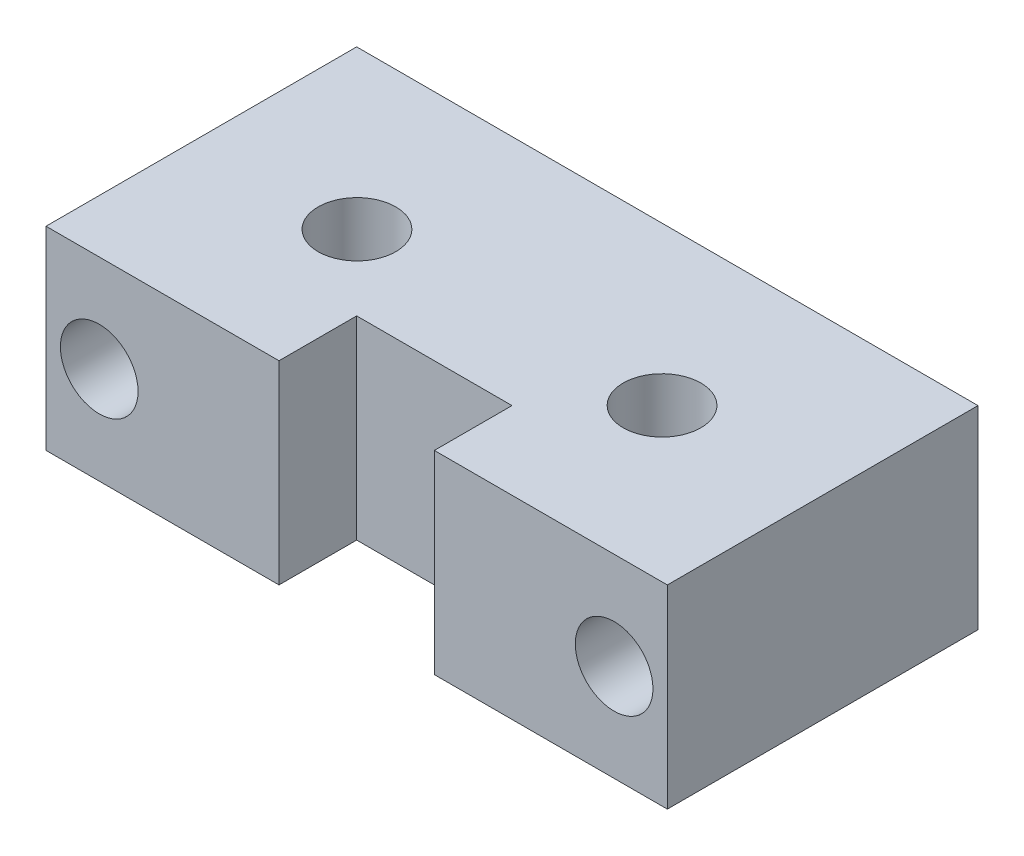
ISO-10303-21;
HEADER;
FILE_DESCRIPTION(('STEP AP214'),'2;1');
FILE_NAME('part.step','',(''),(''),'','','');
FILE_SCHEMA(('AUTOMOTIVE_DESIGN { 1 0 10303 214 1 1 1 1 }'));
ENDSEC;
DATA;
#1=APPLICATION_CONTEXT('core data for automotive mechanical design processes');
#2=APPLICATION_PROTOCOL_DEFINITION('international standard','automotive_design',2000,#1);
#3=PRODUCT_CONTEXT('',#1,'mechanical');
#4=PRODUCT('Part','Part','',(#3));
#5=PRODUCT_RELATED_PRODUCT_CATEGORY('part','',(#4));
#6=PRODUCT_DEFINITION_FORMATION('','',#4);
#7=PRODUCT_DEFINITION_CONTEXT('part definition',#1,'design');
#8=PRODUCT_DEFINITION('design','',#6,#7);
#9=PRODUCT_DEFINITION_SHAPE('','',#8);
#10=(LENGTH_UNIT() NAMED_UNIT(*) SI_UNIT(.MILLI.,.METRE.));
#11=(NAMED_UNIT(*) PLANE_ANGLE_UNIT() SI_UNIT($,.RADIAN.));
#12=(NAMED_UNIT(*) SI_UNIT($,.STERADIAN.) SOLID_ANGLE_UNIT());
#13=UNCERTAINTY_MEASURE_WITH_UNIT(LENGTH_MEASURE(1.E-05),#10,'distance_accuracy_value','');
#14=(GEOMETRIC_REPRESENTATION_CONTEXT(3) GLOBAL_UNCERTAINTY_ASSIGNED_CONTEXT((#13)) GLOBAL_UNIT_ASSIGNED_CONTEXT((#10,
#11,#12)) REPRESENTATION_CONTEXT('',''));
#15=CARTESIAN_POINT('',(0.,0.,0.));
#16=DIRECTION('',(0.,0.,1.));
#17=DIRECTION('',(1.,0.,0.));
#18=AXIS2_PLACEMENT_3D('',#15,#16,#17);
#19=CARTESIAN_POINT('',(0.,10.,0.));
#20=DIRECTION('',(0.,1.,0.));
#21=DIRECTION('',(0.,0.,1.));
#22=AXIS2_PLACEMENT_3D('',#19,#20,#21);
#23=PLANE('',#22);
#24=CARTESIAN_POINT('',(-6.23035799245031,10.,-7.87092417519553));
#25=DIRECTION('',(0.,1.,0.));
#26=DIRECTION('',(0.,0.,1.));
#27=AXIS2_PLACEMENT_3D('',#24,#25,#26);
#28=CIRCLE('',#27,2.);
#29=CARTESIAN_POINT('',(-6.23035799245031,10.,-5.87092417519553));
#30=VERTEX_POINT('',#29);
#31=EDGE_CURVE('E138',#30,#30,#28,.T.);
#32=ORIENTED_EDGE('',*,*,#31,.F.);
#33=EDGE_LOOP('',(#32));
#34=FACE_BOUND('',#33,.T.);
#35=DIRECTION('',(0.,0.,1.));
#36=VECTOR('',#35,1.);
#37=CARTESIAN_POINT('',(-14.375,10.,-16.));
#38=LINE('',#37,#36);
#39=CARTESIAN_POINT('',(-14.375,10.,-16.));
#40=VERTEX_POINT('',#39);
#41=CARTESIAN_POINT('',(-14.375,10.,0.));
#42=VERTEX_POINT('',#41);
#43=EDGE_CURVE('E149',#40,#42,#38,.T.);
#44=ORIENTED_EDGE('',*,*,#43,.T.);
#45=DIRECTION('',(1.,0.,0.));
#46=VECTOR('',#45,1.);
#47=CARTESIAN_POINT('',(-14.375,10.,0.));
#48=LINE('',#47,#46);
#49=CARTESIAN_POINT('',(-2.37499999999999,10.,0.));
#50=VERTEX_POINT('',#49);
#51=EDGE_CURVE('E97',#42,#50,#48,.T.);
#52=ORIENTED_EDGE('',*,*,#51,.T.);
#53=DIRECTION('',(0.,0.,-1.));
#54=VECTOR('',#53,1.);
#55=CARTESIAN_POINT('',(-2.37499999999999,10.,0.));
#56=LINE('',#55,#54);
#57=CARTESIAN_POINT('',(-2.37499999999999,10.,-4.));
#58=VERTEX_POINT('',#57);
#59=EDGE_CURVE('E164',#50,#58,#56,.T.);
#60=ORIENTED_EDGE('',*,*,#59,.T.);
#61=DIRECTION('',(1.,0.,0.));
#62=VECTOR('',#61,1.);
#63=CARTESIAN_POINT('',(-2.37499999999999,10.,-4.));
#64=LINE('',#63,#62);
#65=CARTESIAN_POINT('',(5.62500000000001,10.,-4.));
#66=VERTEX_POINT('',#65);
#67=EDGE_CURVE('E177',#58,#66,#64,.T.);
#68=ORIENTED_EDGE('',*,*,#67,.T.);
#69=DIRECTION('',(0.,0.,1.));
#70=VECTOR('',#69,1.);
#71=CARTESIAN_POINT('',(5.62500000000001,10.,-4.));
#72=LINE('',#71,#70);
#73=CARTESIAN_POINT('',(5.62500000000001,10.,0.));
#74=VERTEX_POINT('',#73);
#75=EDGE_CURVE('E116',#66,#74,#72,.T.);
#76=ORIENTED_EDGE('',*,*,#75,.T.);
#77=DIRECTION('',(1.,0.,0.));
#78=VECTOR('',#77,1.);
#79=CARTESIAN_POINT('',(5.62500000000001,10.,0.));
#80=LINE('',#79,#78);
#81=CARTESIAN_POINT('',(17.625,10.,0.));
#82=VERTEX_POINT('',#81);
#83=EDGE_CURVE('E110',#74,#82,#80,.T.);
#84=ORIENTED_EDGE('',*,*,#83,.T.);
#85=DIRECTION('',(0.,0.,-1.));
#86=VECTOR('',#85,1.);
#87=CARTESIAN_POINT('',(17.625,10.,0.));
#88=LINE('',#87,#86);
#89=CARTESIAN_POINT('',(17.625,10.,-16.));
#90=VERTEX_POINT('',#89);
#91=EDGE_CURVE('E114',#82,#90,#88,.T.);
#92=ORIENTED_EDGE('',*,*,#91,.T.);
#93=DIRECTION('',(-1.,0.,0.));
#94=VECTOR('',#93,1.);
#95=CARTESIAN_POINT('',(17.625,10.,-16.));
#96=LINE('',#95,#94);
#97=EDGE_CURVE('E54',#90,#40,#96,.T.);
#98=ORIENTED_EDGE('',*,*,#97,.T.);
#99=EDGE_LOOP('',(#44,#52,#60,#68,#76,#84,#92,#98));
#100=FACE_BOUND('',#99,.T.);
#101=CARTESIAN_POINT('',(9.48035799245031,10.,-7.87092417519553));
#102=DIRECTION('',(0.,1.,0.));
#103=DIRECTION('',(0.,0.,-1.));
#104=AXIS2_PLACEMENT_3D('',#101,#102,#103);
#105=CIRCLE('',#104,2.00000000000001);
#106=CARTESIAN_POINT('',(9.48035799245031,10.,-9.87092417519553));
#107=VERTEX_POINT('',#106);
#108=EDGE_CURVE('E186',#107,#107,#105,.T.);
#109=ORIENTED_EDGE('',*,*,#108,.F.);
#110=EDGE_LOOP('',(#109));
#111=FACE_BOUND('',#110,.T.);
#112=ADVANCED_FACE('F37',(#34,#100,#111),#23,.T.);
#113=CARTESIAN_POINT('',(0.,0.,0.));
#114=DIRECTION('',(0.,1.,0.));
#115=DIRECTION('',(0.,0.,1.));
#116=AXIS2_PLACEMENT_3D('',#113,#114,#115);
#117=PLANE('',#116);
#118=DIRECTION('',(0.,0.,1.));
#119=VECTOR('',#118,1.);
#120=CARTESIAN_POINT('',(-14.375,0.,-16.));
#121=LINE('',#120,#119);
#122=CARTESIAN_POINT('',(-14.375,0.,-16.));
#123=VERTEX_POINT('',#122);
#124=CARTESIAN_POINT('',(-14.375,0.,0.));
#125=VERTEX_POINT('',#124);
#126=EDGE_CURVE('E134',#123,#125,#121,.T.);
#127=ORIENTED_EDGE('',*,*,#126,.F.);
#128=DIRECTION('',(-1.,0.,0.));
#129=VECTOR('',#128,1.);
#130=CARTESIAN_POINT('',(17.625,0.,-16.));
#131=LINE('',#130,#129);
#132=CARTESIAN_POINT('',(17.625,0.,-16.));
#133=VERTEX_POINT('',#132);
#134=EDGE_CURVE('E89',#133,#123,#131,.T.);
#135=ORIENTED_EDGE('',*,*,#134,.F.);
#136=DIRECTION('',(0.,0.,-1.));
#137=VECTOR('',#136,1.);
#138=CARTESIAN_POINT('',(17.625,0.,0.));
#139=LINE('',#138,#137);
#140=CARTESIAN_POINT('',(17.625,0.,0.));
#141=VERTEX_POINT('',#140);
#142=EDGE_CURVE('E83',#141,#133,#139,.T.);
#143=ORIENTED_EDGE('',*,*,#142,.F.);
#144=DIRECTION('',(1.,0.,0.));
#145=VECTOR('',#144,1.);
#146=CARTESIAN_POINT('',(5.62500000000001,0.,0.));
#147=LINE('',#146,#145);
#148=CARTESIAN_POINT('',(5.62500000000001,0.,0.));
#149=VERTEX_POINT('',#148);
#150=EDGE_CURVE('E124',#149,#141,#147,.T.);
#151=ORIENTED_EDGE('',*,*,#150,.F.);
#152=DIRECTION('',(0.,0.,1.));
#153=VECTOR('',#152,1.);
#154=CARTESIAN_POINT('',(5.62500000000001,0.,-4.));
#155=LINE('',#154,#153);
#156=CARTESIAN_POINT('',(5.62500000000001,0.,-4.));
#157=VERTEX_POINT('',#156);
#158=EDGE_CURVE('E144',#157,#149,#155,.T.);
#159=ORIENTED_EDGE('',*,*,#158,.F.);
#160=DIRECTION('',(1.,0.,0.));
#161=VECTOR('',#160,1.);
#162=CARTESIAN_POINT('',(-2.37499999999999,0.,-4.));
#163=LINE('',#162,#161);
#164=CARTESIAN_POINT('',(-2.37499999999999,0.,-4.));
#165=VERTEX_POINT('',#164);
#166=EDGE_CURVE('E142',#165,#157,#163,.T.);
#167=ORIENTED_EDGE('',*,*,#166,.F.);
#168=DIRECTION('',(0.,0.,-1.));
#169=VECTOR('',#168,1.);
#170=CARTESIAN_POINT('',(-2.37499999999999,0.,0.));
#171=LINE('',#170,#169);
#172=CARTESIAN_POINT('',(-2.37499999999999,0.,0.));
#173=VERTEX_POINT('',#172);
#174=EDGE_CURVE('E140',#173,#165,#171,.T.);
#175=ORIENTED_EDGE('',*,*,#174,.F.);
#176=DIRECTION('',(1.,0.,0.));
#177=VECTOR('',#176,1.);
#178=CARTESIAN_POINT('',(-14.375,0.,0.));
#179=LINE('',#178,#177);
#180=EDGE_CURVE('E137',#125,#173,#179,.T.);
#181=ORIENTED_EDGE('',*,*,#180,.F.);
#182=EDGE_LOOP('',(#127,#135,#143,#151,#159,#167,#175,#181));
#183=FACE_BOUND('',#182,.T.);
#184=CARTESIAN_POINT('',(-6.23035799245031,0.,-7.87092417519553));
#185=DIRECTION('',(0.,1.,0.));
#186=DIRECTION('',(0.,0.,1.));
#187=AXIS2_PLACEMENT_3D('',#184,#185,#186);
#188=CIRCLE('',#187,2.);
#189=CARTESIAN_POINT('',(-6.23035799245031,0.,-5.87092417519553));
#190=VERTEX_POINT('',#189);
#191=EDGE_CURVE('E183',#190,#190,#188,.T.);
#192=ORIENTED_EDGE('',*,*,#191,.T.);
#193=EDGE_LOOP('',(#192));
#194=FACE_BOUND('',#193,.T.);
#195=CARTESIAN_POINT('',(9.48035799245031,0.,-7.87092417519553));
#196=DIRECTION('',(0.,1.,0.));
#197=DIRECTION('',(0.,0.,-1.));
#198=AXIS2_PLACEMENT_3D('',#195,#196,#197);
#199=CIRCLE('',#198,2.00000000000001);
#200=CARTESIAN_POINT('',(9.48035799245031,0.,-9.87092417519553));
#201=VERTEX_POINT('',#200);
#202=EDGE_CURVE('E189',#201,#201,#199,.T.);
#203=ORIENTED_EDGE('',*,*,#202,.T.);
#204=EDGE_LOOP('',(#203));
#205=FACE_BOUND('',#204,.T.);
#206=ADVANCED_FACE('F168',(#183,#194,#205),#117,.F.);
#207=CARTESIAN_POINT('',(-14.375,10.,-16.));
#208=DIRECTION('',(1.,0.,0.));
#209=DIRECTION('',(0.,0.,-1.));
#210=AXIS2_PLACEMENT_3D('',#207,#208,#209);
#211=PLANE('',#210);
#212=ORIENTED_EDGE('',*,*,#126,.T.);
#213=DIRECTION('',(0.,-1.,0.));
#214=VECTOR('',#213,1.);
#215=CARTESIAN_POINT('',(-14.375,10.,0.));
#216=LINE('',#215,#214);
#217=EDGE_CURVE('E12',#42,#125,#216,.T.);
#218=ORIENTED_EDGE('',*,*,#217,.F.);
#219=ORIENTED_EDGE('',*,*,#43,.F.);
#220=DIRECTION('',(0.,-1.,0.));
#221=VECTOR('',#220,1.);
#222=CARTESIAN_POINT('',(-14.375,10.,-16.));
#223=LINE('',#222,#221);
#224=EDGE_CURVE('E130',#40,#123,#223,.T.);
#225=ORIENTED_EDGE('',*,*,#224,.T.);
#226=EDGE_LOOP('',(#212,#218,#219,#225));
#227=FACE_BOUND('',#226,.T.);
#228=ADVANCED_FACE('F39',(#227),#211,.F.);
#229=CARTESIAN_POINT('',(-14.375,10.,0.));
#230=DIRECTION('',(0.,0.,-1.));
#231=DIRECTION('',(-1.,0.,0.));
#232=AXIS2_PLACEMENT_3D('',#229,#230,#231);
#233=PLANE('',#232);
#234=CARTESIAN_POINT('',(-11.6340362520901,5.,0.));
#235=DIRECTION('',(0.,0.,1.));
#236=DIRECTION('',(1.,0.,0.));
#237=AXIS2_PLACEMENT_3D('',#234,#235,#236);
#238=CIRCLE('',#237,2.);
#239=CARTESIAN_POINT('',(-9.63403625209014,5.,0.));
#240=VERTEX_POINT('',#239);
#241=EDGE_CURVE('E198',#240,#240,#238,.T.);
#242=ORIENTED_EDGE('',*,*,#241,.F.);
#243=EDGE_LOOP('',(#242));
#244=FACE_BOUND('',#243,.T.);
#245=ORIENTED_EDGE('',*,*,#180,.T.);
#246=DIRECTION('',(0.,-1.,0.));
#247=VECTOR('',#246,1.);
#248=CARTESIAN_POINT('',(-2.37499999999999,10.,0.));
#249=LINE('',#248,#247);
#250=EDGE_CURVE('E46',#50,#173,#249,.T.);
#251=ORIENTED_EDGE('',*,*,#250,.F.);
#252=ORIENTED_EDGE('',*,*,#51,.F.);
#253=ORIENTED_EDGE('',*,*,#217,.T.);
#254=EDGE_LOOP('',(#245,#251,#252,#253));
#255=FACE_BOUND('',#254,.T.);
#256=ADVANCED_FACE('F210',(#244,#255),#233,.F.);
#257=CARTESIAN_POINT('',(-2.37499999999999,10.,0.));
#258=DIRECTION('',(-1.,0.,0.));
#259=DIRECTION('',(0.,0.,1.));
#260=AXIS2_PLACEMENT_3D('',#257,#258,#259);
#261=PLANE('',#260);
#262=ORIENTED_EDGE('',*,*,#174,.T.);
#263=DIRECTION('',(0.,-1.,0.));
#264=VECTOR('',#263,1.);
#265=CARTESIAN_POINT('',(-2.37499999999999,10.,-4.));
#266=LINE('',#265,#264);
#267=EDGE_CURVE('E156',#58,#165,#266,.T.);
#268=ORIENTED_EDGE('',*,*,#267,.F.);
#269=ORIENTED_EDGE('',*,*,#59,.F.);
#270=ORIENTED_EDGE('',*,*,#250,.T.);
#271=EDGE_LOOP('',(#262,#268,#269,#270));
#272=FACE_BOUND('',#271,.T.);
#273=ADVANCED_FACE('F162',(#272),#261,.F.);
#274=CARTESIAN_POINT('',(-2.37499999999999,10.,-4.));
#275=DIRECTION('',(0.,0.,-1.));
#276=DIRECTION('',(-1.,0.,0.));
#277=AXIS2_PLACEMENT_3D('',#274,#275,#276);
#278=PLANE('',#277);
#279=ORIENTED_EDGE('',*,*,#166,.T.);
#280=DIRECTION('',(0.,-1.,0.));
#281=VECTOR('',#280,1.);
#282=CARTESIAN_POINT('',(5.62500000000001,10.,-4.));
#283=LINE('',#282,#281);
#284=EDGE_CURVE('E153',#66,#157,#283,.T.);
#285=ORIENTED_EDGE('',*,*,#284,.F.);
#286=ORIENTED_EDGE('',*,*,#67,.F.);
#287=ORIENTED_EDGE('',*,*,#267,.T.);
#288=EDGE_LOOP('',(#279,#285,#286,#287));
#289=FACE_BOUND('',#288,.T.);
#290=ADVANCED_FACE('F173',(#289),#278,.F.);
#291=CARTESIAN_POINT('',(5.62500000000001,10.,-4.));
#292=DIRECTION('',(1.,0.,0.));
#293=DIRECTION('',(0.,0.,-1.));
#294=AXIS2_PLACEMENT_3D('',#291,#292,#293);
#295=PLANE('',#294);
#296=ORIENTED_EDGE('',*,*,#158,.T.);
#297=DIRECTION('',(0.,-1.,0.));
#298=VECTOR('',#297,1.);
#299=CARTESIAN_POINT('',(5.62500000000001,10.,0.));
#300=LINE('',#299,#298);
#301=EDGE_CURVE('E125',#74,#149,#300,.T.);
#302=ORIENTED_EDGE('',*,*,#301,.F.);
#303=ORIENTED_EDGE('',*,*,#75,.F.);
#304=ORIENTED_EDGE('',*,*,#284,.T.);
#305=EDGE_LOOP('',(#296,#302,#303,#304));
#306=FACE_BOUND('',#305,.T.);
#307=ADVANCED_FACE('F176',(#306),#295,.F.);
#308=CARTESIAN_POINT('',(5.62500000000001,10.,0.));
#309=DIRECTION('',(0.,0.,-1.));
#310=DIRECTION('',(-1.,0.,0.));
#311=AXIS2_PLACEMENT_3D('',#308,#309,#310);
#312=PLANE('',#311);
#313=CARTESIAN_POINT('',(14.8840362520902,5.,0.));
#314=DIRECTION('',(0.,0.,1.));
#315=DIRECTION('',(1.,0.,0.));
#316=AXIS2_PLACEMENT_3D('',#313,#314,#315);
#317=CIRCLE('',#316,2.);
#318=CARTESIAN_POINT('',(16.8840362520902,5.,0.));
#319=VERTEX_POINT('',#318);
#320=EDGE_CURVE('E199',#319,#319,#317,.T.);
#321=ORIENTED_EDGE('',*,*,#320,.F.);
#322=EDGE_LOOP('',(#321));
#323=FACE_BOUND('',#322,.T.);
#324=ORIENTED_EDGE('',*,*,#150,.T.);
#325=DIRECTION('',(0.,-1.,0.));
#326=VECTOR('',#325,1.);
#327=CARTESIAN_POINT('',(17.625,10.,0.));
#328=LINE('',#327,#326);
#329=EDGE_CURVE('E121',#82,#141,#328,.T.);
#330=ORIENTED_EDGE('',*,*,#329,.F.);
#331=ORIENTED_EDGE('',*,*,#83,.F.);
#332=ORIENTED_EDGE('',*,*,#301,.T.);
#333=EDGE_LOOP('',(#324,#330,#331,#332));
#334=FACE_BOUND('',#333,.T.);
#335=ADVANCED_FACE('F122',(#323,#334),#312,.F.);
#336=CARTESIAN_POINT('',(17.625,10.,0.));
#337=DIRECTION('',(-1.,0.,0.));
#338=DIRECTION('',(0.,0.,1.));
#339=AXIS2_PLACEMENT_3D('',#336,#337,#338);
#340=PLANE('',#339);
#341=ORIENTED_EDGE('',*,*,#142,.T.);
#342=DIRECTION('',(0.,-1.,0.));
#343=VECTOR('',#342,1.);
#344=CARTESIAN_POINT('',(17.625,10.,-16.));
#345=LINE('',#344,#343);
#346=EDGE_CURVE('E126',#90,#133,#345,.T.);
#347=ORIENTED_EDGE('',*,*,#346,.F.);
#348=ORIENTED_EDGE('',*,*,#91,.F.);
#349=ORIENTED_EDGE('',*,*,#329,.T.);
#350=EDGE_LOOP('',(#341,#347,#348,#349));
#351=FACE_BOUND('',#350,.T.);
#352=ADVANCED_FACE('F128',(#351),#340,.F.);
#353=CARTESIAN_POINT('',(17.625,10.,-16.));
#354=DIRECTION('',(0.,0.,1.));
#355=DIRECTION('',(1.,0.,0.));
#356=AXIS2_PLACEMENT_3D('',#353,#354,#355);
#357=PLANE('',#356);
#358=CARTESIAN_POINT('',(-11.6340362520901,5.,-16.));
#359=DIRECTION('',(0.,0.,1.));
#360=DIRECTION('',(1.,0.,0.));
#361=AXIS2_PLACEMENT_3D('',#358,#359,#360);
#362=CIRCLE('',#361,2.);
#363=CARTESIAN_POINT('',(-9.63403625209014,5.,-16.));
#364=VERTEX_POINT('',#363);
#365=EDGE_CURVE('E192',#364,#364,#362,.T.);
#366=ORIENTED_EDGE('',*,*,#365,.T.);
#367=EDGE_LOOP('',(#366));
#368=FACE_BOUND('',#367,.T.);
#369=CARTESIAN_POINT('',(14.8840362520902,5.,-16.));
#370=DIRECTION('',(0.,0.,1.));
#371=DIRECTION('',(1.,0.,0.));
#372=AXIS2_PLACEMENT_3D('',#369,#370,#371);
#373=CIRCLE('',#372,2.);
#374=CARTESIAN_POINT('',(16.8840362520902,5.,-16.));
#375=VERTEX_POINT('',#374);
#376=EDGE_CURVE('E195',#375,#375,#373,.T.);
#377=ORIENTED_EDGE('',*,*,#376,.T.);
#378=EDGE_LOOP('',(#377));
#379=FACE_BOUND('',#378,.T.);
#380=ORIENTED_EDGE('',*,*,#134,.T.);
#381=ORIENTED_EDGE('',*,*,#224,.F.);
#382=ORIENTED_EDGE('',*,*,#97,.F.);
#383=ORIENTED_EDGE('',*,*,#346,.T.);
#384=EDGE_LOOP('',(#380,#381,#382,#383));
#385=FACE_BOUND('',#384,.T.);
#386=ADVANCED_FACE('F215',(#368,#379,#385),#357,.F.);
#387=CARTESIAN_POINT('',(-6.23035799245031,10.,-7.87092417519553));
#388=DIRECTION('',(0.,-1.,0.));
#389=DIRECTION('',(0.,0.,-1.));
#390=AXIS2_PLACEMENT_3D('',#387,#388,#389);
#391=CYLINDRICAL_SURFACE('',#390,2.);
#392=ORIENTED_EDGE('',*,*,#31,.T.);
#393=EDGE_LOOP('',(#392));
#394=FACE_BOUND('',#393,.T.);
#395=ORIENTED_EDGE('',*,*,#191,.F.);
#396=EDGE_LOOP('',(#395));
#397=FACE_BOUND('',#396,.T.);
#398=ADVANCED_FACE('F217',(#394,#397),#391,.F.);
#399=CARTESIAN_POINT('',(9.48035799245031,10.,-7.87092417519553));
#400=DIRECTION('',(0.,-1.,0.));
#401=DIRECTION('',(0.,0.,-1.));
#402=AXIS2_PLACEMENT_3D('',#399,#400,#401);
#403=CYLINDRICAL_SURFACE('',#402,2.00000000000001);
#404=ORIENTED_EDGE('',*,*,#108,.T.);
#405=EDGE_LOOP('',(#404));
#406=FACE_BOUND('',#405,.T.);
#407=ORIENTED_EDGE('',*,*,#202,.F.);
#408=EDGE_LOOP('',(#407));
#409=FACE_BOUND('',#408,.T.);
#410=ADVANCED_FACE('F224',(#406,#409),#403,.F.);
#411=CARTESIAN_POINT('',(14.8840362520902,5.,0.));
#412=DIRECTION('',(0.,0.,-1.));
#413=DIRECTION('',(-1.,0.,0.));
#414=AXIS2_PLACEMENT_3D('',#411,#412,#413);
#415=CYLINDRICAL_SURFACE('',#414,2.);
#416=ORIENTED_EDGE('',*,*,#320,.T.);
#417=EDGE_LOOP('',(#416));
#418=FACE_BOUND('',#417,.T.);
#419=ORIENTED_EDGE('',*,*,#376,.F.);
#420=EDGE_LOOP('',(#419));
#421=FACE_BOUND('',#420,.T.);
#422=ADVANCED_FACE('F240',(#418,#421),#415,.F.);
#423=CARTESIAN_POINT('',(-11.6340362520901,5.,0.));
#424=DIRECTION('',(0.,0.,-1.));
#425=DIRECTION('',(-1.,0.,0.));
#426=AXIS2_PLACEMENT_3D('',#423,#424,#425);
#427=CYLINDRICAL_SURFACE('',#426,2.);
#428=ORIENTED_EDGE('',*,*,#241,.T.);
#429=EDGE_LOOP('',(#428));
#430=FACE_BOUND('',#429,.T.);
#431=ORIENTED_EDGE('',*,*,#365,.F.);
#432=EDGE_LOOP('',(#431));
#433=FACE_BOUND('',#432,.T.);
#434=ADVANCED_FACE('F207',(#430,#433),#427,.F.);
#435=CLOSED_SHELL('',(#112,#206,#228,#256,#273,#290,#307,#335,#352,#386,#398,#410,#422,#434));
#436=MANIFOLD_SOLID_BREP('B2',#435);
#437=ADVANCED_BREP_SHAPE_REPRESENTATION('',(#18,#436),#14);
#438=SHAPE_DEFINITION_REPRESENTATION(#9,#437);
ENDSEC;
END-ISO-10303-21;
